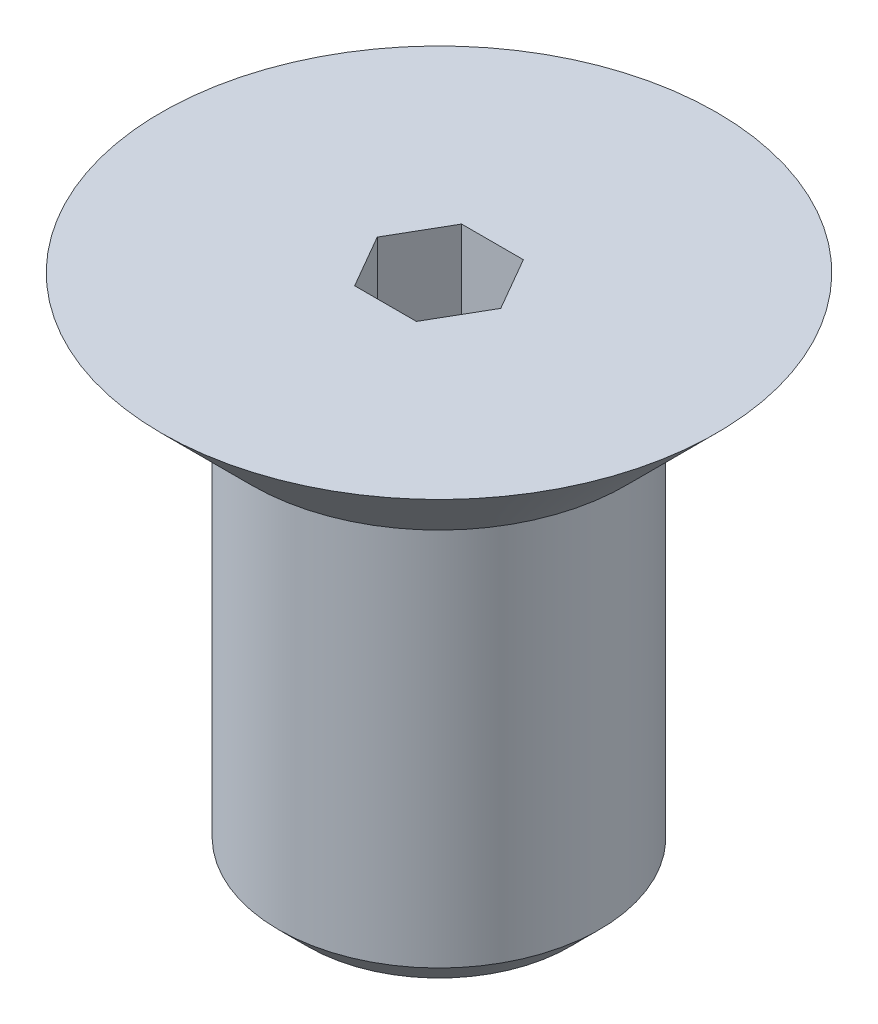
ISO-10303-21;
HEADER;
FILE_DESCRIPTION(('STEP AP214'),'2;1');
FILE_NAME('part.step','',(''),(''),'','','');
FILE_SCHEMA(('AUTOMOTIVE_DESIGN { 1 0 10303 214 1 1 1 1 }'));
ENDSEC;
DATA;
#1=APPLICATION_CONTEXT('core data for automotive mechanical design processes');
#2=APPLICATION_PROTOCOL_DEFINITION('international standard','automotive_design',2000,#1);
#3=PRODUCT_CONTEXT('',#1,'mechanical');
#4=PRODUCT('Part','Part','',(#3));
#5=PRODUCT_RELATED_PRODUCT_CATEGORY('part','',(#4));
#6=PRODUCT_DEFINITION_FORMATION('','',#4);
#7=PRODUCT_DEFINITION_CONTEXT('part definition',#1,'design');
#8=PRODUCT_DEFINITION('design','',#6,#7);
#9=PRODUCT_DEFINITION_SHAPE('','',#8);
#10=(LENGTH_UNIT() NAMED_UNIT(*) SI_UNIT(.MILLI.,.METRE.));
#11=(NAMED_UNIT(*) PLANE_ANGLE_UNIT() SI_UNIT($,.RADIAN.));
#12=(NAMED_UNIT(*) SI_UNIT($,.STERADIAN.) SOLID_ANGLE_UNIT());
#13=UNCERTAINTY_MEASURE_WITH_UNIT(LENGTH_MEASURE(1.E-05),#10,'distance_accuracy_value','');
#14=(GEOMETRIC_REPRESENTATION_CONTEXT(3) GLOBAL_UNCERTAINTY_ASSIGNED_CONTEXT((#13)) GLOBAL_UNIT_ASSIGNED_CONTEXT((#10,
#11,#12)) REPRESENTATION_CONTEXT('',''));
#15=CARTESIAN_POINT('',(0.,0.,0.));
#16=DIRECTION('',(0.,0.,1.));
#17=DIRECTION('',(1.,0.,0.));
#18=AXIS2_PLACEMENT_3D('',#15,#16,#17);
#19=CARTESIAN_POINT('',(0.,0.,0.));
#20=DIRECTION('',(0.,1.,0.));
#21=DIRECTION('',(0.,0.,1.));
#22=AXIS2_PLACEMENT_3D('',#19,#20,#21);
#23=CONICAL_SURFACE('',#22,5.19363819834792,0.785398163397446);
#24=CARTESIAN_POINT('',(0.,-1.69363819834792,0.));
#25=DIRECTION('',(0.,1.,0.));
#26=DIRECTION('',(0.,0.,1.));
#27=AXIS2_PLACEMENT_3D('',#24,#25,#26);
#28=CIRCLE('',#27,3.50000000000001);
#29=CARTESIAN_POINT('',(0.,-1.69363819834792,3.50000000000001));
#30=VERTEX_POINT('',#29);
#31=EDGE_CURVE('E159',#30,#30,#28,.T.);
#32=ORIENTED_EDGE('',*,*,#31,.T.);
#33=EDGE_LOOP('',(#32));
#34=FACE_BOUND('',#33,.T.);
#35=CARTESIAN_POINT('',(0.,0.,0.));
#36=DIRECTION('',(0.,1.,0.));
#37=DIRECTION('',(0.,0.,1.));
#38=AXIS2_PLACEMENT_3D('',#35,#36,#37);
#39=CIRCLE('',#38,5.19363819834792);
#40=CARTESIAN_POINT('',(0.,0.,5.19363819834792));
#41=VERTEX_POINT('',#40);
#42=EDGE_CURVE('E11',#41,#41,#39,.T.);
#43=ORIENTED_EDGE('',*,*,#42,.F.);
#44=EDGE_LOOP('',(#43));
#45=FACE_BOUND('',#44,.T.);
#46=ADVANCED_FACE('F40',(#34,#45),#23,.T.);
#47=CARTESIAN_POINT('',(0.,0.,0.));
#48=DIRECTION('',(0.,1.,0.));
#49=DIRECTION('',(0.,0.,1.));
#50=AXIS2_PLACEMENT_3D('',#47,#48,#49);
#51=PLANE('',#50);
#52=DIRECTION('',(1.,0.,0.));
#53=VECTOR('',#52,1.);
#54=CARTESIAN_POINT('',(-0.577350269189626,0.,1.));
#55=LINE('',#54,#53);
#56=CARTESIAN_POINT('',(-0.577350269189626,0.,1.));
#57=VERTEX_POINT('',#56);
#58=CARTESIAN_POINT('',(0.577350269189626,0.,1.));
#59=VERTEX_POINT('',#58);
#60=EDGE_CURVE('E55',#57,#59,#55,.T.);
#61=ORIENTED_EDGE('',*,*,#60,.F.);
#62=DIRECTION('',(0.5,0.,0.866025403784438));
#63=VECTOR('',#62,1.);
#64=CARTESIAN_POINT('',(-1.15470053837925,0.,0.));
#65=LINE('',#64,#63);
#66=CARTESIAN_POINT('',(-1.15470053837925,0.,0.));
#67=VERTEX_POINT('',#66);
#68=EDGE_CURVE('E138',#67,#57,#65,.T.);
#69=ORIENTED_EDGE('',*,*,#68,.F.);
#70=DIRECTION('',(-0.5,0.,0.866025403784439));
#71=VECTOR('',#70,1.);
#72=CARTESIAN_POINT('',(-0.577350269189626,0.,-1.));
#73=LINE('',#72,#71);
#74=CARTESIAN_POINT('',(-0.577350269189626,0.,-1.));
#75=VERTEX_POINT('',#74);
#76=EDGE_CURVE('E136',#75,#67,#73,.T.);
#77=ORIENTED_EDGE('',*,*,#76,.F.);
#78=DIRECTION('',(-1.,0.,0.));
#79=VECTOR('',#78,1.);
#80=CARTESIAN_POINT('',(0.577350269189625,0.,-1.));
#81=LINE('',#80,#79);
#82=CARTESIAN_POINT('',(0.577350269189625,0.,-1.));
#83=VERTEX_POINT('',#82);
#84=EDGE_CURVE('E102',#83,#75,#81,.T.);
#85=ORIENTED_EDGE('',*,*,#84,.F.);
#86=DIRECTION('',(-0.5,0.,-0.866025403784438));
#87=VECTOR('',#86,1.);
#88=CARTESIAN_POINT('',(1.15470053837925,0.,0.));
#89=LINE('',#88,#87);
#90=CARTESIAN_POINT('',(1.15470053837925,0.,0.));
#91=VERTEX_POINT('',#90);
#92=EDGE_CURVE('E132',#91,#83,#89,.T.);
#93=ORIENTED_EDGE('',*,*,#92,.F.);
#94=DIRECTION('',(0.5,0.,-0.866025403784439));
#95=VECTOR('',#94,1.);
#96=CARTESIAN_POINT('',(0.577350269189626,0.,1.));
#97=LINE('',#96,#95);
#98=EDGE_CURVE('E128',#59,#91,#97,.T.);
#99=ORIENTED_EDGE('',*,*,#98,.F.);
#100=EDGE_LOOP('',(#61,#69,#77,#85,#93,#99));
#101=FACE_BOUND('',#100,.T.);
#102=ORIENTED_EDGE('',*,*,#42,.T.);
#103=EDGE_LOOP('',(#102));
#104=FACE_BOUND('',#103,.T.);
#105=ADVANCED_FACE('F150',(#101,#104),#51,.T.);
#106=CARTESIAN_POINT('',(-0.577350269189626,-2.,1.));
#107=DIRECTION('',(0.,0.,1.));
#108=DIRECTION('',(1.,0.,0.));
#109=AXIS2_PLACEMENT_3D('',#106,#107,#108);
#110=PLANE('',#109);
#111=ORIENTED_EDGE('',*,*,#60,.T.);
#112=DIRECTION('',(0.,1.,0.));
#113=VECTOR('',#112,1.);
#114=CARTESIAN_POINT('',(0.577350269189626,-2.,1.));
#115=LINE('',#114,#113);
#116=CARTESIAN_POINT('',(0.577350269189626,-2.,1.));
#117=VERTEX_POINT('',#116);
#118=EDGE_CURVE('E84',#117,#59,#115,.T.);
#119=ORIENTED_EDGE('',*,*,#118,.F.);
#120=DIRECTION('',(1.,0.,0.));
#121=VECTOR('',#120,1.);
#122=CARTESIAN_POINT('',(-0.577350269189626,-2.,1.));
#123=LINE('',#122,#121);
#124=CARTESIAN_POINT('',(-0.577350269189626,-2.,1.));
#125=VERTEX_POINT('',#124);
#126=EDGE_CURVE('E140',#125,#117,#123,.T.);
#127=ORIENTED_EDGE('',*,*,#126,.F.);
#128=DIRECTION('',(0.,1.,0.));
#129=VECTOR('',#128,1.);
#130=CARTESIAN_POINT('',(-0.577350269189626,-2.,1.));
#131=LINE('',#130,#129);
#132=EDGE_CURVE('E48',#125,#57,#131,.T.);
#133=ORIENTED_EDGE('',*,*,#132,.T.);
#134=EDGE_LOOP('',(#111,#119,#127,#133));
#135=FACE_BOUND('',#134,.T.);
#136=ADVANCED_FACE('F186',(#135),#110,.F.);
#137=CARTESIAN_POINT('',(-1.15470053837925,-2.,0.));
#138=DIRECTION('',(-0.866025403784438,0.,0.5));
#139=DIRECTION('',(0.5,0.,0.866025403784439));
#140=AXIS2_PLACEMENT_3D('',#137,#138,#139);
#141=PLANE('',#140);
#142=ORIENTED_EDGE('',*,*,#68,.T.);
#143=ORIENTED_EDGE('',*,*,#132,.F.);
#144=DIRECTION('',(0.5,0.,0.866025403784438));
#145=VECTOR('',#144,1.);
#146=CARTESIAN_POINT('',(-1.15470053837925,-2.,0.));
#147=LINE('',#146,#145);
#148=CARTESIAN_POINT('',(-1.15470053837925,-2.,0.));
#149=VERTEX_POINT('',#148);
#150=EDGE_CURVE('E114',#149,#125,#147,.T.);
#151=ORIENTED_EDGE('',*,*,#150,.F.);
#152=DIRECTION('',(0.,1.,0.));
#153=VECTOR('',#152,1.);
#154=CARTESIAN_POINT('',(-1.15470053837925,-2.,0.));
#155=LINE('',#154,#153);
#156=EDGE_CURVE('E106',#149,#67,#155,.T.);
#157=ORIENTED_EDGE('',*,*,#156,.T.);
#158=EDGE_LOOP('',(#142,#143,#151,#157));
#159=FACE_BOUND('',#158,.T.);
#160=ADVANCED_FACE('F192',(#159),#141,.F.);
#161=CARTESIAN_POINT('',(-0.577350269189626,-2.,-1.));
#162=DIRECTION('',(-0.866025403784439,0.,-0.5));
#163=DIRECTION('',(-0.5,0.,0.866025403784439));
#164=AXIS2_PLACEMENT_3D('',#161,#162,#163);
#165=PLANE('',#164);
#166=ORIENTED_EDGE('',*,*,#76,.T.);
#167=ORIENTED_EDGE('',*,*,#156,.F.);
#168=DIRECTION('',(-0.5,0.,0.866025403784439));
#169=VECTOR('',#168,1.);
#170=CARTESIAN_POINT('',(-0.577350269189626,-2.,-1.));
#171=LINE('',#170,#169);
#172=CARTESIAN_POINT('',(-0.577350269189626,-2.,-1.));
#173=VERTEX_POINT('',#172);
#174=EDGE_CURVE('E110',#173,#149,#171,.T.);
#175=ORIENTED_EDGE('',*,*,#174,.F.);
#176=DIRECTION('',(0.,1.,0.));
#177=VECTOR('',#176,1.);
#178=CARTESIAN_POINT('',(-0.577350269189626,-2.,-1.));
#179=LINE('',#178,#177);
#180=EDGE_CURVE('E95',#173,#75,#179,.T.);
#181=ORIENTED_EDGE('',*,*,#180,.T.);
#182=EDGE_LOOP('',(#166,#167,#175,#181));
#183=FACE_BOUND('',#182,.T.);
#184=ADVANCED_FACE('F111',(#183),#165,.F.);
#185=CARTESIAN_POINT('',(0.577350269189625,-2.,-1.));
#186=DIRECTION('',(0.,0.,-1.));
#187=DIRECTION('',(-1.,0.,0.));
#188=AXIS2_PLACEMENT_3D('',#185,#186,#187);
#189=PLANE('',#188);
#190=ORIENTED_EDGE('',*,*,#84,.T.);
#191=ORIENTED_EDGE('',*,*,#180,.F.);
#192=DIRECTION('',(-1.,0.,0.));
#193=VECTOR('',#192,1.);
#194=CARTESIAN_POINT('',(0.577350269189625,-2.,-1.));
#195=LINE('',#194,#193);
#196=CARTESIAN_POINT('',(0.577350269189625,-2.,-1.));
#197=VERTEX_POINT('',#196);
#198=EDGE_CURVE('E99',#197,#173,#195,.T.);
#199=ORIENTED_EDGE('',*,*,#198,.F.);
#200=DIRECTION('',(0.,1.,0.));
#201=VECTOR('',#200,1.);
#202=CARTESIAN_POINT('',(0.577350269189625,-2.,-1.));
#203=LINE('',#202,#201);
#204=EDGE_CURVE('E107',#197,#83,#203,.T.);
#205=ORIENTED_EDGE('',*,*,#204,.T.);
#206=EDGE_LOOP('',(#190,#191,#199,#205));
#207=FACE_BOUND('',#206,.T.);
#208=ADVANCED_FACE('F97',(#207),#189,.F.);
#209=CARTESIAN_POINT('',(1.15470053837925,-2.,0.));
#210=DIRECTION('',(0.866025403784438,0.,-0.5));
#211=DIRECTION('',(-0.5,0.,-0.866025403784438));
#212=AXIS2_PLACEMENT_3D('',#209,#210,#211);
#213=PLANE('',#212);
#214=ORIENTED_EDGE('',*,*,#92,.T.);
#215=ORIENTED_EDGE('',*,*,#204,.F.);
#216=DIRECTION('',(-0.5,0.,-0.866025403784438));
#217=VECTOR('',#216,1.);
#218=CARTESIAN_POINT('',(1.15470053837925,-2.,0.));
#219=LINE('',#218,#217);
#220=CARTESIAN_POINT('',(1.15470053837925,-2.,0.));
#221=VERTEX_POINT('',#220);
#222=EDGE_CURVE('E120',#221,#197,#219,.T.);
#223=ORIENTED_EDGE('',*,*,#222,.F.);
#224=DIRECTION('',(0.,1.,0.));
#225=VECTOR('',#224,1.);
#226=CARTESIAN_POINT('',(1.15470053837925,-2.,0.));
#227=LINE('',#226,#225);
#228=EDGE_CURVE('E144',#221,#91,#227,.T.);
#229=ORIENTED_EDGE('',*,*,#228,.T.);
#230=EDGE_LOOP('',(#214,#215,#223,#229));
#231=FACE_BOUND('',#230,.T.);
#232=ADVANCED_FACE('F154',(#231),#213,.F.);
#233=CARTESIAN_POINT('',(0.577350269189626,-2.,1.));
#234=DIRECTION('',(0.866025403784439,0.,0.5));
#235=DIRECTION('',(0.5,0.,-0.866025403784439));
#236=AXIS2_PLACEMENT_3D('',#233,#234,#235);
#237=PLANE('',#236);
#238=ORIENTED_EDGE('',*,*,#98,.T.);
#239=ORIENTED_EDGE('',*,*,#228,.F.);
#240=DIRECTION('',(0.5,0.,-0.866025403784439));
#241=VECTOR('',#240,1.);
#242=CARTESIAN_POINT('',(0.577350269189626,-2.,1.));
#243=LINE('',#242,#241);
#244=EDGE_CURVE('E122',#117,#221,#243,.T.);
#245=ORIENTED_EDGE('',*,*,#244,.F.);
#246=ORIENTED_EDGE('',*,*,#118,.T.);
#247=EDGE_LOOP('',(#238,#239,#245,#246));
#248=FACE_BOUND('',#247,.T.);
#249=ADVANCED_FACE('F147',(#248),#237,.F.);
#250=CARTESIAN_POINT('',(0.,-2.,0.));
#251=DIRECTION('',(0.,1.,0.));
#252=DIRECTION('',(0.,0.,1.));
#253=AXIS2_PLACEMENT_3D('',#250,#251,#252);
#254=PLANE('',#253);
#255=ORIENTED_EDGE('',*,*,#126,.T.);
#256=ORIENTED_EDGE('',*,*,#244,.T.);
#257=ORIENTED_EDGE('',*,*,#222,.T.);
#258=ORIENTED_EDGE('',*,*,#198,.T.);
#259=ORIENTED_EDGE('',*,*,#174,.T.);
#260=ORIENTED_EDGE('',*,*,#150,.T.);
#261=EDGE_LOOP('',(#255,#256,#257,#258,#259,#260));
#262=FACE_BOUND('',#261,.T.);
#263=ADVANCED_FACE('F117',(#262),#254,.T.);
#264=CARTESIAN_POINT('',(0.,-9.69363819834792,0.));
#265=DIRECTION('',(0.,1.,0.));
#266=DIRECTION('',(0.,0.,1.));
#267=AXIS2_PLACEMENT_3D('',#264,#265,#266);
#268=CYLINDRICAL_SURFACE('',#267,3.);
#269=CARTESIAN_POINT('',(0.,-1.69363819834792,0.));
#270=DIRECTION('',(0.,1.,0.));
#271=DIRECTION('',(0.,0.,1.));
#272=AXIS2_PLACEMENT_3D('',#269,#270,#271);
#273=CIRCLE('',#272,3.);
#274=CARTESIAN_POINT('',(0.,-1.69363819834792,3.));
#275=VERTEX_POINT('',#274);
#276=EDGE_CURVE('E129',#275,#275,#273,.T.);
#277=ORIENTED_EDGE('',*,*,#276,.F.);
#278=EDGE_LOOP('',(#277));
#279=FACE_BOUND('',#278,.T.);
#280=CARTESIAN_POINT('',(0.,-9.13913819834792,0.));
#281=DIRECTION('',(0.,1.,0.));
#282=DIRECTION('',(0.,0.,1.));
#283=AXIS2_PLACEMENT_3D('',#280,#281,#282);
#284=CIRCLE('',#283,3.);
#285=CARTESIAN_POINT('',(0.,-9.13913819834792,3.));
#286=VERTEX_POINT('',#285);
#287=EDGE_CURVE('E165',#286,#286,#284,.T.);
#288=ORIENTED_EDGE('',*,*,#287,.T.);
#289=EDGE_LOOP('',(#288));
#290=FACE_BOUND('',#289,.T.);
#291=ADVANCED_FACE('F169',(#279,#290),#268,.T.);
#292=CARTESIAN_POINT('',(3.,-1.69363819834792,0.));
#293=DIRECTION('',(0.,1.,0.));
#294=DIRECTION('',(0.,0.,1.));
#295=AXIS2_PLACEMENT_3D('',#292,#293,#294);
#296=PLANE('',#295);
#297=ORIENTED_EDGE('',*,*,#31,.F.);
#298=EDGE_LOOP('',(#297));
#299=FACE_BOUND('',#298,.T.);
#300=ORIENTED_EDGE('',*,*,#276,.T.);
#301=EDGE_LOOP('',(#300));
#302=FACE_BOUND('',#301,.T.);
#303=ADVANCED_FACE('F174',(#299,#302),#296,.F.);
#304=CARTESIAN_POINT('',(0.,-9.69363819834792,0.));
#305=DIRECTION('',(0.,1.,0.));
#306=DIRECTION('',(0.,0.,1.));
#307=AXIS2_PLACEMENT_3D('',#304,#305,#306);
#308=CONICAL_SURFACE('',#307,2.4455,0.785398163397448);
#309=ORIENTED_EDGE('',*,*,#287,.F.);
#310=EDGE_LOOP('',(#309));
#311=FACE_BOUND('',#310,.T.);
#312=CARTESIAN_POINT('',(0.,-9.69363819834792,0.));
#313=DIRECTION('',(0.,1.,0.));
#314=DIRECTION('',(0.,0.,1.));
#315=AXIS2_PLACEMENT_3D('',#312,#313,#314);
#316=CIRCLE('',#315,2.4455);
#317=CARTESIAN_POINT('',(0.,-9.69363819834792,2.4455));
#318=VERTEX_POINT('',#317);
#319=EDGE_CURVE('E162',#318,#318,#316,.T.);
#320=ORIENTED_EDGE('',*,*,#319,.T.);
#321=EDGE_LOOP('',(#320));
#322=FACE_BOUND('',#321,.T.);
#323=ADVANCED_FACE('F171',(#311,#322),#308,.T.);
#324=CARTESIAN_POINT('',(0.,-9.69363819834792,0.));
#325=DIRECTION('',(0.,1.,0.));
#326=DIRECTION('',(0.,0.,1.));
#327=AXIS2_PLACEMENT_3D('',#324,#325,#326);
#328=PLANE('',#327);
#329=ORIENTED_EDGE('',*,*,#319,.F.);
#330=EDGE_LOOP('',(#329));
#331=FACE_BOUND('',#330,.T.);
#332=ADVANCED_FACE('F42',(#331),#328,.F.);
#333=CLOSED_SHELL('',(#46,#105,#136,#160,#184,#208,#232,#249,#263,#291,#303,#323,#332));
#334=MANIFOLD_SOLID_BREP('B2',#333);
#335=ADVANCED_BREP_SHAPE_REPRESENTATION('',(#18,#334),#14);
#336=SHAPE_DEFINITION_REPRESENTATION(#9,#335);
ENDSEC;
END-ISO-10303-21;
